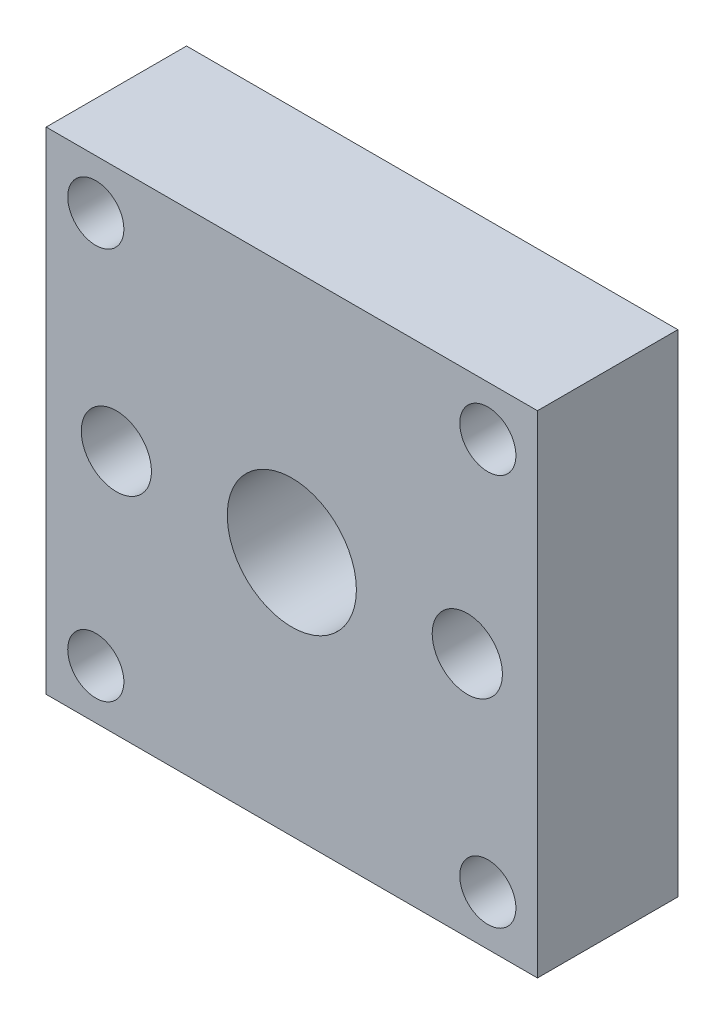
ISO-10303-21;
HEADER;
FILE_DESCRIPTION(('STEP AP214'),'2;1');
FILE_NAME('part.step','',(''),(''),'','','');
FILE_SCHEMA(('AUTOMOTIVE_DESIGN { 1 0 10303 214 1 1 1 1 }'));
ENDSEC;
DATA;
#1=APPLICATION_CONTEXT('core data for automotive mechanical design processes');
#2=APPLICATION_PROTOCOL_DEFINITION('international standard','automotive_design',2000,#1);
#3=PRODUCT_CONTEXT('',#1,'mechanical');
#4=PRODUCT('Part','Part','',(#3));
#5=PRODUCT_RELATED_PRODUCT_CATEGORY('part','',(#4));
#6=PRODUCT_DEFINITION_FORMATION('','',#4);
#7=PRODUCT_DEFINITION_CONTEXT('part definition',#1,'design');
#8=PRODUCT_DEFINITION('design','',#6,#7);
#9=PRODUCT_DEFINITION_SHAPE('','',#8);
#10=(LENGTH_UNIT() NAMED_UNIT(*) SI_UNIT(.MILLI.,.METRE.));
#11=(NAMED_UNIT(*) PLANE_ANGLE_UNIT() SI_UNIT($,.RADIAN.));
#12=(NAMED_UNIT(*) SI_UNIT($,.STERADIAN.) SOLID_ANGLE_UNIT());
#13=UNCERTAINTY_MEASURE_WITH_UNIT(LENGTH_MEASURE(1.E-05),#10,'distance_accuracy_value','');
#14=(GEOMETRIC_REPRESENTATION_CONTEXT(3) GLOBAL_UNCERTAINTY_ASSIGNED_CONTEXT((#13)) GLOBAL_UNIT_ASSIGNED_CONTEXT((#10,
#11,#12)) REPRESENTATION_CONTEXT('',''));
#15=CARTESIAN_POINT('',(0.,0.,0.));
#16=DIRECTION('',(0.,0.,1.));
#17=DIRECTION('',(1.,0.,0.));
#18=AXIS2_PLACEMENT_3D('',#15,#16,#17);
#19=CARTESIAN_POINT('',(0.,0.,10.));
#20=DIRECTION('',(0.,0.,1.));
#21=DIRECTION('',(1.,0.,0.));
#22=AXIS2_PLACEMENT_3D('',#19,#20,#21);
#23=PLANE('',#22);
#24=CARTESIAN_POINT('',(-4.46806206231328,-5.05880735241497,10.));
#25=DIRECTION('',(0.,0.,1.));
#26=DIRECTION('',(1.,0.,0.));
#27=AXIS2_PLACEMENT_3D('',#24,#25,#26);
#28=CIRCLE('',#27,2.5);
#29=CARTESIAN_POINT('',(-1.96806206231327,-5.05880735241497,10.));
#30=VERTEX_POINT('',#29);
#31=EDGE_CURVE('E139',#30,#30,#28,.T.);
#32=ORIENTED_EDGE('',*,*,#31,.F.);
#33=EDGE_LOOP('',(#32));
#34=FACE_BOUND('',#33,.T.);
#35=CARTESIAN_POINT('',(-5.93252815638054,-19.0232734464822,10.));
#36=DIRECTION('',(0.,0.,1.));
#37=DIRECTION('',(-1.,0.,0.));
#38=AXIS2_PLACEMENT_3D('',#35,#36,#37);
#39=CIRCLE('',#38,2.);
#40=CARTESIAN_POINT('',(-7.93252815638055,-19.0232734464822,10.));
#41=VERTEX_POINT('',#40);
#42=EDGE_CURVE('E127',#41,#41,#39,.T.);
#43=ORIENTED_EDGE('',*,*,#42,.F.);
#44=EDGE_LOOP('',(#43));
#45=FACE_BOUND('',#44,.T.);
#46=CARTESIAN_POINT('',(21.996404031754,-19.0232734464822,10.));
#47=DIRECTION('',(0.,0.,1.));
#48=DIRECTION('',(1.,0.,0.));
#49=AXIS2_PLACEMENT_3D('',#46,#47,#48);
#50=CIRCLE('',#49,2.);
#51=CARTESIAN_POINT('',(23.996404031754,-19.0232734464822,10.));
#52=VERTEX_POINT('',#51);
#53=EDGE_CURVE('E115',#52,#52,#50,.T.);
#54=ORIENTED_EDGE('',*,*,#53,.F.);
#55=EDGE_LOOP('',(#54));
#56=FACE_BOUND('',#55,.T.);
#57=DIRECTION('',(0.,-1.,0.));
#58=VECTOR('',#57,1.);
#59=CARTESIAN_POINT('',(-9.46806206231327,12.441192647585,10.));
#60=LINE('',#59,#58);
#61=CARTESIAN_POINT('',(-9.46806206231327,12.441192647585,10.));
#62=VERTEX_POINT('',#61);
#63=CARTESIAN_POINT('',(-9.46806206231327,-22.558807352415,10.));
#64=VERTEX_POINT('',#63);
#65=EDGE_CURVE('E85',#62,#64,#60,.T.);
#66=ORIENTED_EDGE('',*,*,#65,.T.);
#67=DIRECTION('',(1.,0.,0.));
#68=VECTOR('',#67,1.);
#69=CARTESIAN_POINT('',(-9.46806206231327,-22.558807352415,10.));
#70=LINE('',#69,#68);
#71=CARTESIAN_POINT('',(25.5319379376867,-22.558807352415,10.));
#72=VERTEX_POINT('',#71);
#73=EDGE_CURVE('E80',#64,#72,#70,.T.);
#74=ORIENTED_EDGE('',*,*,#73,.T.);
#75=DIRECTION('',(0.,1.,0.));
#76=VECTOR('',#75,1.);
#77=CARTESIAN_POINT('',(25.5319379376867,12.441192647585,10.));
#78=LINE('',#77,#76);
#79=CARTESIAN_POINT('',(25.5319379376867,12.441192647585,10.));
#80=VERTEX_POINT('',#79);
#81=EDGE_CURVE('E83',#72,#80,#78,.T.);
#82=ORIENTED_EDGE('',*,*,#81,.T.);
#83=DIRECTION('',(-1.,0.,0.));
#84=VECTOR('',#83,1.);
#85=CARTESIAN_POINT('',(-9.46806206231327,12.441192647585,10.));
#86=LINE('',#85,#84);
#87=EDGE_CURVE('E50',#80,#62,#86,.T.);
#88=ORIENTED_EDGE('',*,*,#87,.T.);
#89=EDGE_LOOP('',(#66,#74,#82,#88));
#90=FACE_BOUND('',#89,.T.);
#91=CARTESIAN_POINT('',(8.03193793768673,-5.05880735241497,10.));
#92=DIRECTION('',(0.,0.,1.));
#93=DIRECTION('',(1.,0.,0.));
#94=AXIS2_PLACEMENT_3D('',#91,#92,#93);
#95=CIRCLE('',#94,4.6);
#96=CARTESIAN_POINT('',(12.6319379376867,-5.05880735241497,10.));
#97=VERTEX_POINT('',#96);
#98=EDGE_CURVE('E100',#97,#97,#95,.T.);
#99=ORIENTED_EDGE('',*,*,#98,.F.);
#100=EDGE_LOOP('',(#99));
#101=FACE_BOUND('',#100,.T.);
#102=CARTESIAN_POINT('',(21.996404031754,8.9056587416523,10.));
#103=DIRECTION('',(0.,0.,1.));
#104=DIRECTION('',(-1.,0.,0.));
#105=AXIS2_PLACEMENT_3D('',#102,#103,#104);
#106=CIRCLE('',#105,2.);
#107=CARTESIAN_POINT('',(19.996404031754,8.9056587416523,10.));
#108=VERTEX_POINT('',#107);
#109=EDGE_CURVE('E121',#108,#108,#106,.T.);
#110=ORIENTED_EDGE('',*,*,#109,.F.);
#111=EDGE_LOOP('',(#110));
#112=FACE_BOUND('',#111,.T.);
#113=CARTESIAN_POINT('',(-5.93252815638053,8.9056587416523,10.));
#114=DIRECTION('',(0.,0.,1.));
#115=DIRECTION('',(1.,0.,0.));
#116=AXIS2_PLACEMENT_3D('',#113,#114,#115);
#117=CIRCLE('',#116,2.);
#118=CARTESIAN_POINT('',(-3.93252815638053,8.9056587416523,10.));
#119=VERTEX_POINT('',#118);
#120=EDGE_CURVE('E133',#119,#119,#117,.T.);
#121=ORIENTED_EDGE('',*,*,#120,.F.);
#122=EDGE_LOOP('',(#121));
#123=FACE_BOUND('',#122,.T.);
#124=CARTESIAN_POINT('',(20.5319379376867,-5.05880735241497,10.));
#125=DIRECTION('',(0.,0.,1.));
#126=DIRECTION('',(-1.,0.,0.));
#127=AXIS2_PLACEMENT_3D('',#124,#125,#126);
#128=CIRCLE('',#127,2.5);
#129=CARTESIAN_POINT('',(18.0319379376867,-5.05880735241497,10.));
#130=VERTEX_POINT('',#129);
#131=EDGE_CURVE('E145',#130,#130,#128,.T.);
#132=ORIENTED_EDGE('',*,*,#131,.F.);
#133=EDGE_LOOP('',(#132));
#134=FACE_BOUND('',#133,.T.);
#135=ADVANCED_FACE('F33',(#34,#45,#56,#90,#101,#112,#123,#134),#23,.T.);
#136=CARTESIAN_POINT('',(0.,0.,0.));
#137=DIRECTION('',(0.,0.,1.));
#138=DIRECTION('',(1.,0.,0.));
#139=AXIS2_PLACEMENT_3D('',#136,#137,#138);
#140=PLANE('',#139);
#141=DIRECTION('',(0.,-1.,0.));
#142=VECTOR('',#141,1.);
#143=CARTESIAN_POINT('',(-9.46806206231327,12.441192647585,0.));
#144=LINE('',#143,#142);
#145=CARTESIAN_POINT('',(-9.46806206231327,12.441192647585,0.));
#146=VERTEX_POINT('',#145);
#147=CARTESIAN_POINT('',(-9.46806206231327,-22.558807352415,0.));
#148=VERTEX_POINT('',#147);
#149=EDGE_CURVE('E97',#146,#148,#144,.T.);
#150=ORIENTED_EDGE('',*,*,#149,.F.);
#151=DIRECTION('',(-1.,0.,0.));
#152=VECTOR('',#151,1.);
#153=CARTESIAN_POINT('',(-9.46806206231327,12.441192647585,0.));
#154=LINE('',#153,#152);
#155=CARTESIAN_POINT('',(25.5319379376867,12.441192647585,0.));
#156=VERTEX_POINT('',#155);
#157=EDGE_CURVE('E73',#156,#146,#154,.T.);
#158=ORIENTED_EDGE('',*,*,#157,.F.);
#159=DIRECTION('',(0.,1.,0.));
#160=VECTOR('',#159,1.);
#161=CARTESIAN_POINT('',(25.5319379376867,12.441192647585,0.));
#162=LINE('',#161,#160);
#163=CARTESIAN_POINT('',(25.5319379376867,-22.558807352415,0.));
#164=VERTEX_POINT('',#163);
#165=EDGE_CURVE('E67',#164,#156,#162,.T.);
#166=ORIENTED_EDGE('',*,*,#165,.F.);
#167=DIRECTION('',(1.,0.,0.));
#168=VECTOR('',#167,1.);
#169=CARTESIAN_POINT('',(-9.46806206231327,-22.558807352415,0.));
#170=LINE('',#169,#168);
#171=EDGE_CURVE('E89',#148,#164,#170,.T.);
#172=ORIENTED_EDGE('',*,*,#171,.F.);
#173=EDGE_LOOP('',(#150,#158,#166,#172));
#174=FACE_BOUND('',#173,.T.);
#175=CARTESIAN_POINT('',(8.03193793768673,-5.05880735241497,0.));
#176=DIRECTION('',(0.,0.,1.));
#177=DIRECTION('',(1.,0.,0.));
#178=AXIS2_PLACEMENT_3D('',#175,#176,#177);
#179=CIRCLE('',#178,4.6);
#180=CARTESIAN_POINT('',(12.6319379376867,-5.05880735241497,0.));
#181=VERTEX_POINT('',#180);
#182=EDGE_CURVE('E112',#181,#181,#179,.T.);
#183=ORIENTED_EDGE('',*,*,#182,.T.);
#184=EDGE_LOOP('',(#183));
#185=FACE_BOUND('',#184,.T.);
#186=CARTESIAN_POINT('',(21.996404031754,-19.0232734464822,0.));
#187=DIRECTION('',(0.,0.,1.));
#188=DIRECTION('',(1.,0.,0.));
#189=AXIS2_PLACEMENT_3D('',#186,#187,#188);
#190=CIRCLE('',#189,2.);
#191=CARTESIAN_POINT('',(23.996404031754,-19.0232734464822,0.));
#192=VERTEX_POINT('',#191);
#193=EDGE_CURVE('E118',#192,#192,#190,.T.);
#194=ORIENTED_EDGE('',*,*,#193,.T.);
#195=EDGE_LOOP('',(#194));
#196=FACE_BOUND('',#195,.T.);
#197=CARTESIAN_POINT('',(21.996404031754,8.9056587416523,0.));
#198=DIRECTION('',(0.,0.,1.));
#199=DIRECTION('',(-1.,0.,0.));
#200=AXIS2_PLACEMENT_3D('',#197,#198,#199);
#201=CIRCLE('',#200,2.);
#202=CARTESIAN_POINT('',(19.996404031754,8.9056587416523,0.));
#203=VERTEX_POINT('',#202);
#204=EDGE_CURVE('E124',#203,#203,#201,.T.);
#205=ORIENTED_EDGE('',*,*,#204,.T.);
#206=EDGE_LOOP('',(#205));
#207=FACE_BOUND('',#206,.T.);
#208=CARTESIAN_POINT('',(-5.93252815638054,-19.0232734464822,0.));
#209=DIRECTION('',(0.,0.,1.));
#210=DIRECTION('',(-1.,0.,0.));
#211=AXIS2_PLACEMENT_3D('',#208,#209,#210);
#212=CIRCLE('',#211,2.);
#213=CARTESIAN_POINT('',(-7.93252815638055,-19.0232734464822,0.));
#214=VERTEX_POINT('',#213);
#215=EDGE_CURVE('E130',#214,#214,#212,.T.);
#216=ORIENTED_EDGE('',*,*,#215,.T.);
#217=EDGE_LOOP('',(#216));
#218=FACE_BOUND('',#217,.T.);
#219=CARTESIAN_POINT('',(-5.93252815638053,8.9056587416523,0.));
#220=DIRECTION('',(0.,0.,1.));
#221=DIRECTION('',(1.,0.,0.));
#222=AXIS2_PLACEMENT_3D('',#219,#220,#221);
#223=CIRCLE('',#222,2.);
#224=CARTESIAN_POINT('',(-3.93252815638053,8.9056587416523,0.));
#225=VERTEX_POINT('',#224);
#226=EDGE_CURVE('E136',#225,#225,#223,.T.);
#227=ORIENTED_EDGE('',*,*,#226,.T.);
#228=EDGE_LOOP('',(#227));
#229=FACE_BOUND('',#228,.T.);
#230=CARTESIAN_POINT('',(-4.46806206231328,-5.05880735241497,0.));
#231=DIRECTION('',(0.,0.,1.));
#232=DIRECTION('',(1.,0.,0.));
#233=AXIS2_PLACEMENT_3D('',#230,#231,#232);
#234=CIRCLE('',#233,2.5);
#235=CARTESIAN_POINT('',(-1.96806206231327,-5.05880735241497,0.));
#236=VERTEX_POINT('',#235);
#237=EDGE_CURVE('E142',#236,#236,#234,.T.);
#238=ORIENTED_EDGE('',*,*,#237,.T.);
#239=EDGE_LOOP('',(#238));
#240=FACE_BOUND('',#239,.T.);
#241=CARTESIAN_POINT('',(20.5319379376867,-5.05880735241497,0.));
#242=DIRECTION('',(0.,0.,1.));
#243=DIRECTION('',(-1.,0.,0.));
#244=AXIS2_PLACEMENT_3D('',#241,#242,#243);
#245=CIRCLE('',#244,2.5);
#246=CARTESIAN_POINT('',(18.0319379376867,-5.05880735241497,0.));
#247=VERTEX_POINT('',#246);
#248=EDGE_CURVE('E148',#247,#247,#245,.T.);
#249=ORIENTED_EDGE('',*,*,#248,.T.);
#250=EDGE_LOOP('',(#249));
#251=FACE_BOUND('',#250,.T.);
#252=ADVANCED_FACE('F108',(#174,#185,#196,#207,#218,#229,#240,#251),#140,.F.);
#253=CARTESIAN_POINT('',(-9.46806206231327,12.441192647585,10.));
#254=DIRECTION('',(1.,0.,0.));
#255=DIRECTION('',(0.,0.,-1.));
#256=AXIS2_PLACEMENT_3D('',#253,#254,#255);
#257=PLANE('',#256);
#258=ORIENTED_EDGE('',*,*,#149,.T.);
#259=DIRECTION('',(0.,0.,-1.));
#260=VECTOR('',#259,1.);
#261=CARTESIAN_POINT('',(-9.46806206231327,-22.558807352415,10.));
#262=LINE('',#261,#260);
#263=EDGE_CURVE('E11',#64,#148,#262,.T.);
#264=ORIENTED_EDGE('',*,*,#263,.F.);
#265=ORIENTED_EDGE('',*,*,#65,.F.);
#266=DIRECTION('',(0.,0.,-1.));
#267=VECTOR('',#266,1.);
#268=CARTESIAN_POINT('',(-9.46806206231327,12.441192647585,10.));
#269=LINE('',#268,#267);
#270=EDGE_CURVE('E93',#62,#146,#269,.T.);
#271=ORIENTED_EDGE('',*,*,#270,.T.);
#272=EDGE_LOOP('',(#258,#264,#265,#271));
#273=FACE_BOUND('',#272,.T.);
#274=ADVANCED_FACE('F35',(#273),#257,.F.);
#275=CARTESIAN_POINT('',(-9.46806206231327,-22.558807352415,10.));
#276=DIRECTION('',(0.,1.,0.));
#277=DIRECTION('',(0.,0.,1.));
#278=AXIS2_PLACEMENT_3D('',#275,#276,#277);
#279=PLANE('',#278);
#280=ORIENTED_EDGE('',*,*,#171,.T.);
#281=DIRECTION('',(0.,0.,-1.));
#282=VECTOR('',#281,1.);
#283=CARTESIAN_POINT('',(25.5319379376867,-22.558807352415,10.));
#284=LINE('',#283,#282);
#285=EDGE_CURVE('E42',#72,#164,#284,.T.);
#286=ORIENTED_EDGE('',*,*,#285,.F.);
#287=ORIENTED_EDGE('',*,*,#73,.F.);
#288=ORIENTED_EDGE('',*,*,#263,.T.);
#289=EDGE_LOOP('',(#280,#286,#287,#288));
#290=FACE_BOUND('',#289,.T.);
#291=ADVANCED_FACE('F88',(#290),#279,.F.);
#292=CARTESIAN_POINT('',(25.5319379376867,12.441192647585,10.));
#293=DIRECTION('',(-1.,0.,0.));
#294=DIRECTION('',(0.,0.,1.));
#295=AXIS2_PLACEMENT_3D('',#292,#293,#294);
#296=PLANE('',#295);
#297=ORIENTED_EDGE('',*,*,#165,.T.);
#298=DIRECTION('',(0.,0.,-1.));
#299=VECTOR('',#298,1.);
#300=CARTESIAN_POINT('',(25.5319379376867,12.441192647585,10.));
#301=LINE('',#300,#299);
#302=EDGE_CURVE('E90',#80,#156,#301,.T.);
#303=ORIENTED_EDGE('',*,*,#302,.F.);
#304=ORIENTED_EDGE('',*,*,#81,.F.);
#305=ORIENTED_EDGE('',*,*,#285,.T.);
#306=EDGE_LOOP('',(#297,#303,#304,#305));
#307=FACE_BOUND('',#306,.T.);
#308=ADVANCED_FACE('F91',(#307),#296,.F.);
#309=CARTESIAN_POINT('',(-9.46806206231327,12.441192647585,10.));
#310=DIRECTION('',(0.,-1.,0.));
#311=DIRECTION('',(0.,0.,-1.));
#312=AXIS2_PLACEMENT_3D('',#309,#310,#311);
#313=PLANE('',#312);
#314=ORIENTED_EDGE('',*,*,#157,.T.);
#315=ORIENTED_EDGE('',*,*,#270,.F.);
#316=ORIENTED_EDGE('',*,*,#87,.F.);
#317=ORIENTED_EDGE('',*,*,#302,.T.);
#318=EDGE_LOOP('',(#314,#315,#316,#317));
#319=FACE_BOUND('',#318,.T.);
#320=ADVANCED_FACE('F105',(#319),#313,.F.);
#321=CARTESIAN_POINT('',(8.03193793768673,-5.05880735241497,10.));
#322=DIRECTION('',(0.,0.,-1.));
#323=DIRECTION('',(-1.,0.,0.));
#324=AXIS2_PLACEMENT_3D('',#321,#322,#323);
#325=CYLINDRICAL_SURFACE('',#324,4.6);
#326=ORIENTED_EDGE('',*,*,#98,.T.);
#327=EDGE_LOOP('',(#326));
#328=FACE_BOUND('',#327,.T.);
#329=ORIENTED_EDGE('',*,*,#182,.F.);
#330=EDGE_LOOP('',(#329));
#331=FACE_BOUND('',#330,.T.);
#332=ADVANCED_FACE('F167',(#328,#331),#325,.F.);
#333=CARTESIAN_POINT('',(21.996404031754,-19.0232734464822,10.));
#334=DIRECTION('',(0.,0.,-1.));
#335=DIRECTION('',(-1.,0.,0.));
#336=AXIS2_PLACEMENT_3D('',#333,#334,#335);
#337=CYLINDRICAL_SURFACE('',#336,2.);
#338=ORIENTED_EDGE('',*,*,#53,.T.);
#339=EDGE_LOOP('',(#338));
#340=FACE_BOUND('',#339,.T.);
#341=ORIENTED_EDGE('',*,*,#193,.F.);
#342=EDGE_LOOP('',(#341));
#343=FACE_BOUND('',#342,.T.);
#344=ADVANCED_FACE('F213',(#340,#343),#337,.F.);
#345=CARTESIAN_POINT('',(21.996404031754,8.9056587416523,10.));
#346=DIRECTION('',(0.,0.,-1.));
#347=DIRECTION('',(-1.,0.,0.));
#348=AXIS2_PLACEMENT_3D('',#345,#346,#347);
#349=CYLINDRICAL_SURFACE('',#348,2.);
#350=ORIENTED_EDGE('',*,*,#109,.T.);
#351=EDGE_LOOP('',(#350));
#352=FACE_BOUND('',#351,.T.);
#353=ORIENTED_EDGE('',*,*,#204,.F.);
#354=EDGE_LOOP('',(#353));
#355=FACE_BOUND('',#354,.T.);
#356=ADVANCED_FACE('F221',(#352,#355),#349,.F.);
#357=CARTESIAN_POINT('',(-5.93252815638054,-19.0232734464822,10.));
#358=DIRECTION('',(0.,0.,-1.));
#359=DIRECTION('',(-1.,0.,0.));
#360=AXIS2_PLACEMENT_3D('',#357,#358,#359);
#361=CYLINDRICAL_SURFACE('',#360,2.);
#362=ORIENTED_EDGE('',*,*,#42,.T.);
#363=EDGE_LOOP('',(#362));
#364=FACE_BOUND('',#363,.T.);
#365=ORIENTED_EDGE('',*,*,#215,.F.);
#366=EDGE_LOOP('',(#365));
#367=FACE_BOUND('',#366,.T.);
#368=ADVANCED_FACE('F229',(#364,#367),#361,.F.);
#369=CARTESIAN_POINT('',(-5.93252815638053,8.9056587416523,10.));
#370=DIRECTION('',(0.,0.,-1.));
#371=DIRECTION('',(-1.,0.,0.));
#372=AXIS2_PLACEMENT_3D('',#369,#370,#371);
#373=CYLINDRICAL_SURFACE('',#372,2.);
#374=ORIENTED_EDGE('',*,*,#120,.T.);
#375=EDGE_LOOP('',(#374));
#376=FACE_BOUND('',#375,.T.);
#377=ORIENTED_EDGE('',*,*,#226,.F.);
#378=EDGE_LOOP('',(#377));
#379=FACE_BOUND('',#378,.T.);
#380=ADVANCED_FACE('F238',(#376,#379),#373,.F.);
#381=CARTESIAN_POINT('',(-4.46806206231328,-5.05880735241497,10.));
#382=DIRECTION('',(0.,0.,-1.));
#383=DIRECTION('',(-1.,0.,0.));
#384=AXIS2_PLACEMENT_3D('',#381,#382,#383);
#385=CYLINDRICAL_SURFACE('',#384,2.5);
#386=ORIENTED_EDGE('',*,*,#31,.T.);
#387=EDGE_LOOP('',(#386));
#388=FACE_BOUND('',#387,.T.);
#389=ORIENTED_EDGE('',*,*,#237,.F.);
#390=EDGE_LOOP('',(#389));
#391=FACE_BOUND('',#390,.T.);
#392=ADVANCED_FACE('F247',(#388,#391),#385,.F.);
#393=CARTESIAN_POINT('',(20.5319379376867,-5.05880735241497,10.));
#394=DIRECTION('',(0.,0.,-1.));
#395=DIRECTION('',(-1.,0.,0.));
#396=AXIS2_PLACEMENT_3D('',#393,#394,#395);
#397=CYLINDRICAL_SURFACE('',#396,2.5);
#398=ORIENTED_EDGE('',*,*,#131,.T.);
#399=EDGE_LOOP('',(#398));
#400=FACE_BOUND('',#399,.T.);
#401=ORIENTED_EDGE('',*,*,#248,.F.);
#402=EDGE_LOOP('',(#401));
#403=FACE_BOUND('',#402,.T.);
#404=ADVANCED_FACE('F154',(#400,#403),#397,.F.);
#405=CLOSED_SHELL('',(#135,#252,#274,#291,#308,#320,#332,#344,#356,#368,#380,#392,#404));
#406=MANIFOLD_SOLID_BREP('B2',#405);
#407=ADVANCED_BREP_SHAPE_REPRESENTATION('',(#18,#406),#14);
#408=SHAPE_DEFINITION_REPRESENTATION(#9,#407);
ENDSEC;
END-ISO-10303-21;
